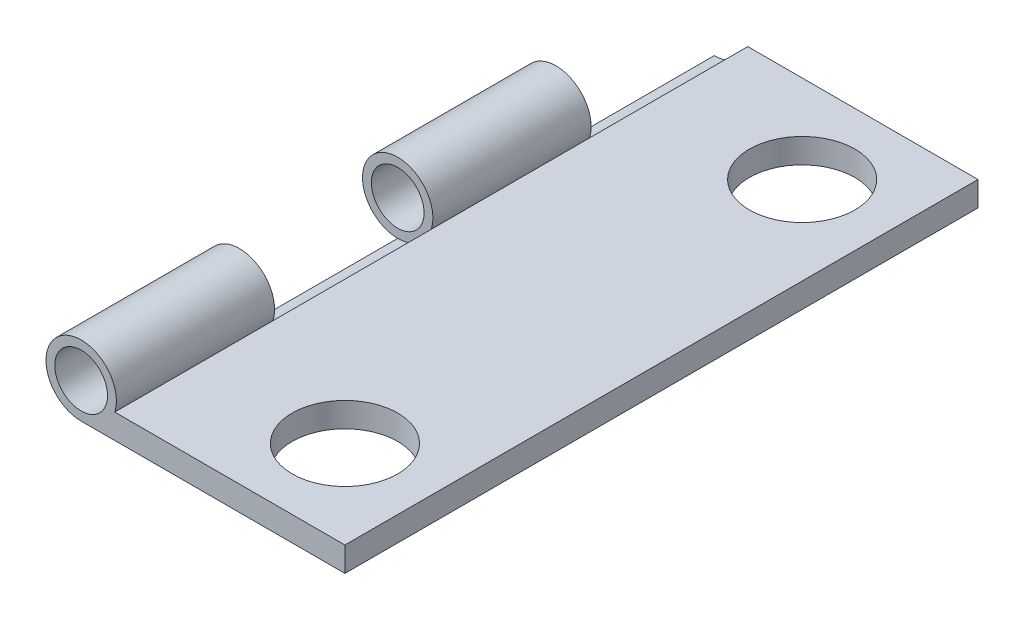
ISO-10303-21;
HEADER;
FILE_DESCRIPTION(('STEP AP214'),'2;1');
FILE_NAME('part.step','',(''),(''),'','','');
FILE_SCHEMA(('AUTOMOTIVE_DESIGN { 1 0 10303 214 1 1 1 1 }'));
ENDSEC;
DATA;
#1=APPLICATION_CONTEXT('core data for automotive mechanical design processes');
#2=APPLICATION_PROTOCOL_DEFINITION('international standard','automotive_design',2000,#1);
#3=PRODUCT_CONTEXT('',#1,'mechanical');
#4=PRODUCT('Part','Part','',(#3));
#5=PRODUCT_RELATED_PRODUCT_CATEGORY('part','',(#4));
#6=PRODUCT_DEFINITION_FORMATION('','',#4);
#7=PRODUCT_DEFINITION_CONTEXT('part definition',#1,'design');
#8=PRODUCT_DEFINITION('design','',#6,#7);
#9=PRODUCT_DEFINITION_SHAPE('','',#8);
#10=(LENGTH_UNIT() NAMED_UNIT(*) SI_UNIT(.MILLI.,.METRE.));
#11=(NAMED_UNIT(*) PLANE_ANGLE_UNIT() SI_UNIT($,.RADIAN.));
#12=(NAMED_UNIT(*) SI_UNIT($,.STERADIAN.) SOLID_ANGLE_UNIT());
#13=UNCERTAINTY_MEASURE_WITH_UNIT(LENGTH_MEASURE(1.E-05),#10,'distance_accuracy_value','');
#14=(GEOMETRIC_REPRESENTATION_CONTEXT(3) GLOBAL_UNCERTAINTY_ASSIGNED_CONTEXT((#13)) GLOBAL_UNIT_ASSIGNED_CONTEXT((#10,
#11,#12)) REPRESENTATION_CONTEXT('',''));
#15=CARTESIAN_POINT('',(0.,0.,0.));
#16=DIRECTION('',(0.,0.,1.));
#17=DIRECTION('',(1.,0.,0.));
#18=AXIS2_PLACEMENT_3D('',#15,#16,#17);
#19=CARTESIAN_POINT('',(0.,1.,-18.));
#20=DIRECTION('',(0.,0.,1.));
#21=DIRECTION('',(1.,0.,0.));
#22=AXIS2_PLACEMENT_3D('',#19,#20,#21);
#23=CYLINDRICAL_SURFACE('',#22,1.);
#24=CARTESIAN_POINT('',(0.,1.,-13.5));
#25=DIRECTION('',(0.,0.,1.));
#26=DIRECTION('',(1.,0.,0.));
#27=AXIS2_PLACEMENT_3D('',#24,#25,#26);
#28=CIRCLE('',#27,1.);
#29=CARTESIAN_POINT('',(0.953939201416945,0.7,-13.5));
#30=VERTEX_POINT('',#29);
#31=CARTESIAN_POINT('',(0.,0.,-13.5));
#32=VERTEX_POINT('',#31);
#33=EDGE_CURVE('E113',#30,#32,#28,.T.);
#34=ORIENTED_EDGE('',*,*,#33,.T.);
#35=DIRECTION('',(0.,0.,1.));
#36=VECTOR('',#35,1.);
#37=CARTESIAN_POINT('',(0.,0.,0.));
#38=LINE('',#37,#36);
#39=CARTESIAN_POINT('',(0.,0.,-9.));
#40=VERTEX_POINT('',#39);
#41=EDGE_CURVE('E106',#32,#40,#38,.T.);
#42=ORIENTED_EDGE('',*,*,#41,.T.);
#43=CARTESIAN_POINT('',(0.,1.,-9.));
#44=DIRECTION('',(0.,0.,1.));
#45=DIRECTION('',(1.,0.,0.));
#46=AXIS2_PLACEMENT_3D('',#43,#44,#45);
#47=CIRCLE('',#46,1.);
#48=CARTESIAN_POINT('',(0.953939201416945,0.7,-9.));
#49=VERTEX_POINT('',#48);
#50=EDGE_CURVE('E146',#49,#40,#47,.T.);
#51=ORIENTED_EDGE('',*,*,#50,.F.);
#52=DIRECTION('',(0.,0.,1.));
#53=VECTOR('',#52,1.);
#54=CARTESIAN_POINT('',(0.953939201416946,0.7,-18.));
#55=LINE('',#54,#53);
#56=EDGE_CURVE('E118',#30,#49,#55,.T.);
#57=ORIENTED_EDGE('',*,*,#56,.F.);
#58=EDGE_LOOP('',(#34,#42,#51,#57));
#59=FACE_BOUND('',#58,.T.);
#60=ADVANCED_FACE('F32',(#59),#23,.T.);
#61=CARTESIAN_POINT('',(0.,1.,-18.));
#62=DIRECTION('',(0.,0.,1.));
#63=DIRECTION('',(1.,0.,0.));
#64=AXIS2_PLACEMENT_3D('',#61,#62,#63);
#65=CYLINDRICAL_SURFACE('',#64,0.75);
#66=CARTESIAN_POINT('',(0.,1.,-13.5));
#67=DIRECTION('',(0.,0.,1.));
#68=DIRECTION('',(1.,0.,0.));
#69=AXIS2_PLACEMENT_3D('',#66,#67,#68);
#70=CIRCLE('',#69,0.75);
#71=CARTESIAN_POINT('',(0.75,1.,-13.5));
#72=VERTEX_POINT('',#71);
#73=EDGE_CURVE('E152',#72,#72,#70,.F.);
#74=ORIENTED_EDGE('',*,*,#73,.T.);
#75=EDGE_LOOP('',(#74));
#76=FACE_BOUND('',#75,.T.);
#77=CARTESIAN_POINT('',(0.,1.,-9.));
#78=DIRECTION('',(0.,0.,1.));
#79=DIRECTION('',(1.,0.,0.));
#80=AXIS2_PLACEMENT_3D('',#77,#78,#79);
#81=CIRCLE('',#80,0.75);
#82=CARTESIAN_POINT('',(0.75,1.,-9.));
#83=VERTEX_POINT('',#82);
#84=EDGE_CURVE('E36',#83,#83,#81,.F.);
#85=ORIENTED_EDGE('',*,*,#84,.F.);
#86=EDGE_LOOP('',(#85));
#87=FACE_BOUND('',#86,.T.);
#88=ADVANCED_FACE('F206',(#76,#87),#65,.F.);
#89=CARTESIAN_POINT('',(0.,0.7,0.));
#90=DIRECTION('',(0.,0.,-1.));
#91=DIRECTION('',(-1.,0.,0.));
#92=AXIS2_PLACEMENT_3D('',#89,#90,#91);
#93=PLANE('',#92);
#94=CARTESIAN_POINT('',(0.,1.,0.));
#95=DIRECTION('',(0.,0.,1.));
#96=DIRECTION('',(1.,0.,0.));
#97=AXIS2_PLACEMENT_3D('',#94,#95,#96);
#98=CIRCLE('',#97,0.75);
#99=CARTESIAN_POINT('',(0.75,1.,0.));
#100=VERTEX_POINT('',#99);
#101=EDGE_CURVE('E140',#100,#100,#98,.T.);
#102=ORIENTED_EDGE('',*,*,#101,.F.);
#103=EDGE_LOOP('',(#102));
#104=FACE_BOUND('',#103,.T.);
#105=CARTESIAN_POINT('',(0.,1.,0.));
#106=DIRECTION('',(0.,0.,1.));
#107=DIRECTION('',(1.,0.,0.));
#108=AXIS2_PLACEMENT_3D('',#105,#106,#107);
#109=CIRCLE('',#108,1.);
#110=CARTESIAN_POINT('',(0.953939201416946,0.7,0.));
#111=VERTEX_POINT('',#110);
#112=CARTESIAN_POINT('',(0.,0.,0.));
#113=VERTEX_POINT('',#112);
#114=EDGE_CURVE('E138',#111,#113,#109,.T.);
#115=ORIENTED_EDGE('',*,*,#114,.T.);
#116=DIRECTION('',(1.,0.,0.));
#117=VECTOR('',#116,1.);
#118=CARTESIAN_POINT('',(0.,0.,0.));
#119=LINE('',#118,#117);
#120=CARTESIAN_POINT('',(7.5,0.,0.));
#121=VERTEX_POINT('',#120);
#122=EDGE_CURVE('E105',#113,#121,#119,.T.);
#123=ORIENTED_EDGE('',*,*,#122,.T.);
#124=DIRECTION('',(0.,-1.,0.));
#125=VECTOR('',#124,1.);
#126=CARTESIAN_POINT('',(7.5,0.7,0.));
#127=LINE('',#126,#125);
#128=CARTESIAN_POINT('',(7.5,0.7,0.));
#129=VERTEX_POINT('',#128);
#130=EDGE_CURVE('E11',#129,#121,#127,.T.);
#131=ORIENTED_EDGE('',*,*,#130,.F.);
#132=DIRECTION('',(1.,0.,0.));
#133=VECTOR('',#132,1.);
#134=CARTESIAN_POINT('',(0.,0.7,0.));
#135=LINE('',#134,#133);
#136=EDGE_CURVE('E191',#111,#129,#135,.T.);
#137=ORIENTED_EDGE('',*,*,#136,.F.);
#138=EDGE_LOOP('',(#115,#123,#131,#137));
#139=FACE_BOUND('',#138,.T.);
#140=ADVANCED_FACE('F34',(#104,#139),#93,.F.);
#141=CARTESIAN_POINT('',(7.5,0.7,0.));
#142=DIRECTION('',(-1.,0.,0.));
#143=DIRECTION('',(0.,0.,1.));
#144=AXIS2_PLACEMENT_3D('',#141,#142,#143);
#145=PLANE('',#144);
#146=DIRECTION('',(0.,0.,-1.));
#147=VECTOR('',#146,1.);
#148=CARTESIAN_POINT('',(7.5,0.,0.));
#149=LINE('',#148,#147);
#150=CARTESIAN_POINT('',(7.5,0.,-18.));
#151=VERTEX_POINT('',#150);
#152=EDGE_CURVE('E195',#121,#151,#149,.T.);
#153=ORIENTED_EDGE('',*,*,#152,.T.);
#154=DIRECTION('',(0.,-1.,0.));
#155=VECTOR('',#154,1.);
#156=CARTESIAN_POINT('',(7.5,0.7,-18.));
#157=LINE('',#156,#155);
#158=CARTESIAN_POINT('',(7.5,0.7,-18.));
#159=VERTEX_POINT('',#158);
#160=EDGE_CURVE('E41',#159,#151,#157,.T.);
#161=ORIENTED_EDGE('',*,*,#160,.F.);
#162=DIRECTION('',(0.,0.,-1.));
#163=VECTOR('',#162,1.);
#164=CARTESIAN_POINT('',(7.5,0.7,0.));
#165=LINE('',#164,#163);
#166=EDGE_CURVE('E186',#129,#159,#165,.T.);
#167=ORIENTED_EDGE('',*,*,#166,.F.);
#168=ORIENTED_EDGE('',*,*,#130,.T.);
#169=EDGE_LOOP('',(#153,#161,#167,#168));
#170=FACE_BOUND('',#169,.T.);
#171=ADVANCED_FACE('F215',(#170),#145,.F.);
#172=CARTESIAN_POINT('',(0.,0.7,-18.));
#173=DIRECTION('',(0.,0.,1.));
#174=DIRECTION('',(1.,0.,0.));
#175=AXIS2_PLACEMENT_3D('',#172,#173,#174);
#176=PLANE('',#175);
#177=DIRECTION('',(-1.,0.,0.));
#178=VECTOR('',#177,1.);
#179=CARTESIAN_POINT('',(0.,0.,-18.));
#180=LINE('',#179,#178);
#181=CARTESIAN_POINT('',(0.,0.,-18.));
#182=VERTEX_POINT('',#181);
#183=EDGE_CURVE('E193',#151,#182,#180,.T.);
#184=ORIENTED_EDGE('',*,*,#183,.T.);
#185=CARTESIAN_POINT('',(0.,1.,-18.));
#186=DIRECTION('',(0.,0.,1.));
#187=DIRECTION('',(1.,0.,0.));
#188=AXIS2_PLACEMENT_3D('',#185,#186,#187);
#189=CIRCLE('',#188,1.);
#190=CARTESIAN_POINT('',(0.953939201416945,0.7,-18.));
#191=VERTEX_POINT('',#190);
#192=EDGE_CURVE('E100',#182,#191,#189,.T.);
#193=ORIENTED_EDGE('',*,*,#192,.T.);
#194=DIRECTION('',(-1.,0.,0.));
#195=VECTOR('',#194,1.);
#196=CARTESIAN_POINT('',(0.,0.7,-18.));
#197=LINE('',#196,#195);
#198=EDGE_CURVE('E184',#159,#191,#197,.T.);
#199=ORIENTED_EDGE('',*,*,#198,.F.);
#200=ORIENTED_EDGE('',*,*,#160,.T.);
#201=EDGE_LOOP('',(#184,#193,#199,#200));
#202=FACE_BOUND('',#201,.T.);
#203=ADVANCED_FACE('F180',(#202),#176,.F.);
#204=CARTESIAN_POINT('',(0.,0.7,0.));
#205=DIRECTION('',(0.,-1.,0.));
#206=DIRECTION('',(0.,0.,-1.));
#207=AXIS2_PLACEMENT_3D('',#204,#205,#206);
#208=PLANE('',#207);
#209=CARTESIAN_POINT('',(5.,0.7,-2.5));
#210=DIRECTION('',(0.,1.,0.));
#211=DIRECTION('',(0.,0.,1.));
#212=AXIS2_PLACEMENT_3D('',#209,#210,#211);
#213=CIRCLE('',#212,1.5);
#214=CARTESIAN_POINT('',(5.,0.7,-0.999999999999999));
#215=VERTEX_POINT('',#214);
#216=EDGE_CURVE('E162',#215,#215,#213,.T.);
#217=ORIENTED_EDGE('',*,*,#216,.F.);
#218=EDGE_LOOP('',(#217));
#219=FACE_BOUND('',#218,.T.);
#220=CARTESIAN_POINT('',(5.,0.7,-15.5));
#221=DIRECTION('',(0.,1.,0.));
#222=DIRECTION('',(0.,0.,-1.));
#223=AXIS2_PLACEMENT_3D('',#220,#221,#222);
#224=CIRCLE('',#223,1.5);
#225=CARTESIAN_POINT('',(5.,0.7,-17.));
#226=VERTEX_POINT('',#225);
#227=EDGE_CURVE('E156',#226,#226,#224,.T.);
#228=ORIENTED_EDGE('',*,*,#227,.F.);
#229=EDGE_LOOP('',(#228));
#230=FACE_BOUND('',#229,.T.);
#231=ORIENTED_EDGE('',*,*,#198,.T.);
#232=EDGE_CURVE('E127',#191,#30,#55,.T.);
#233=ORIENTED_EDGE('',*,*,#232,.T.);
#234=ORIENTED_EDGE('',*,*,#56,.T.);
#235=CARTESIAN_POINT('',(0.953939201416945,0.7,-4.5));
#236=VERTEX_POINT('',#235);
#237=EDGE_CURVE('E133',#49,#236,#55,.T.);
#238=ORIENTED_EDGE('',*,*,#237,.T.);
#239=EDGE_CURVE('E56',#236,#111,#55,.T.);
#240=ORIENTED_EDGE('',*,*,#239,.T.);
#241=ORIENTED_EDGE('',*,*,#136,.T.);
#242=ORIENTED_EDGE('',*,*,#166,.T.);
#243=EDGE_LOOP('',(#231,#233,#234,#238,#240,#241,#242));
#244=FACE_BOUND('',#243,.T.);
#245=ADVANCED_FACE('F177',(#219,#230,#244),#208,.F.);
#246=CARTESIAN_POINT('',(0.,0.,0.));
#247=DIRECTION('',(0.,-1.,0.));
#248=DIRECTION('',(0.,0.,-1.));
#249=AXIS2_PLACEMENT_3D('',#246,#247,#248);
#250=PLANE('',#249);
#251=CARTESIAN_POINT('',(5.,0.,-2.5));
#252=DIRECTION('',(0.,1.,0.));
#253=DIRECTION('',(0.,0.,1.));
#254=AXIS2_PLACEMENT_3D('',#251,#252,#253);
#255=CIRCLE('',#254,1.5);
#256=CARTESIAN_POINT('',(5.,0.,-0.999999999999999));
#257=VERTEX_POINT('',#256);
#258=EDGE_CURVE('E120',#257,#257,#255,.T.);
#259=ORIENTED_EDGE('',*,*,#258,.T.);
#260=EDGE_LOOP('',(#259));
#261=FACE_BOUND('',#260,.T.);
#262=CARTESIAN_POINT('',(5.,0.,-15.5));
#263=DIRECTION('',(0.,1.,0.));
#264=DIRECTION('',(0.,0.,-1.));
#265=AXIS2_PLACEMENT_3D('',#262,#263,#264);
#266=CIRCLE('',#265,1.5);
#267=CARTESIAN_POINT('',(5.,0.,-17.));
#268=VERTEX_POINT('',#267);
#269=EDGE_CURVE('E159',#268,#268,#266,.T.);
#270=ORIENTED_EDGE('',*,*,#269,.T.);
#271=EDGE_LOOP('',(#270));
#272=FACE_BOUND('',#271,.T.);
#273=EDGE_CURVE('E94',#182,#32,#38,.T.);
#274=ORIENTED_EDGE('',*,*,#273,.F.);
#275=ORIENTED_EDGE('',*,*,#183,.F.);
#276=ORIENTED_EDGE('',*,*,#152,.F.);
#277=ORIENTED_EDGE('',*,*,#122,.F.);
#278=CARTESIAN_POINT('',(0.,0.,-4.5));
#279=VERTEX_POINT('',#278);
#280=EDGE_CURVE('E124',#279,#113,#38,.T.);
#281=ORIENTED_EDGE('',*,*,#280,.F.);
#282=EDGE_CURVE('E108',#40,#279,#38,.T.);
#283=ORIENTED_EDGE('',*,*,#282,.F.);
#284=ORIENTED_EDGE('',*,*,#41,.F.);
#285=EDGE_LOOP('',(#274,#275,#276,#277,#281,#283,#284));
#286=FACE_BOUND('',#285,.T.);
#287=ADVANCED_FACE('F122',(#261,#272,#286),#250,.T.);
#288=CARTESIAN_POINT('',(0.,1.,-4.5));
#289=DIRECTION('',(0.,0.,1.));
#290=DIRECTION('',(1.,0.,0.));
#291=AXIS2_PLACEMENT_3D('',#288,#289,#290);
#292=CIRCLE('',#291,1.);
#293=EDGE_CURVE('E147',#236,#279,#292,.T.);
#294=ORIENTED_EDGE('',*,*,#293,.T.);
#295=ORIENTED_EDGE('',*,*,#280,.T.);
#296=ORIENTED_EDGE('',*,*,#114,.F.);
#297=ORIENTED_EDGE('',*,*,#239,.F.);
#298=EDGE_LOOP('',(#294,#295,#296,#297));
#299=FACE_BOUND('',#298,.T.);
#300=ADVANCED_FACE('F218',(#299),#23,.T.);
#301=CARTESIAN_POINT('',(0.,1.,-4.5));
#302=DIRECTION('',(0.,0.,1.));
#303=DIRECTION('',(1.,0.,0.));
#304=AXIS2_PLACEMENT_3D('',#301,#302,#303);
#305=CIRCLE('',#304,0.75);
#306=CARTESIAN_POINT('',(0.75,1.,-4.5));
#307=VERTEX_POINT('',#306);
#308=EDGE_CURVE('E151',#307,#307,#305,.F.);
#309=ORIENTED_EDGE('',*,*,#308,.T.);
#310=EDGE_LOOP('',(#309));
#311=FACE_BOUND('',#310,.T.);
#312=ORIENTED_EDGE('',*,*,#101,.T.);
#313=EDGE_LOOP('',(#312));
#314=FACE_BOUND('',#313,.T.);
#315=ADVANCED_FACE('F210',(#311,#314),#65,.F.);
#316=CARTESIAN_POINT('',(0.,1.,-9.));
#317=DIRECTION('',(0.,0.,1.));
#318=DIRECTION('',(1.,0.,0.));
#319=AXIS2_PLACEMENT_3D('',#316,#317,#318);
#320=CYLINDRICAL_SURFACE('',#319,1.);
#321=EDGE_CURVE('E148',#40,#49,#47,.T.);
#322=ORIENTED_EDGE('',*,*,#321,.F.);
#323=ORIENTED_EDGE('',*,*,#282,.T.);
#324=EDGE_CURVE('E48',#279,#236,#292,.T.);
#325=ORIENTED_EDGE('',*,*,#324,.T.);
#326=ORIENTED_EDGE('',*,*,#237,.F.);
#327=EDGE_LOOP('',(#322,#323,#325,#326));
#328=FACE_BOUND('',#327,.T.);
#329=ADVANCED_FACE('F221',(#328),#320,.F.);
#330=CARTESIAN_POINT('',(0.,1.,-9.));
#331=DIRECTION('',(0.,0.,1.));
#332=DIRECTION('',(1.,0.,0.));
#333=AXIS2_PLACEMENT_3D('',#330,#331,#332);
#334=PLANE('',#333);
#335=ORIENTED_EDGE('',*,*,#321,.T.);
#336=ORIENTED_EDGE('',*,*,#50,.T.);
#337=EDGE_LOOP('',(#335,#336));
#338=FACE_BOUND('',#337,.T.);
#339=ORIENTED_EDGE('',*,*,#84,.T.);
#340=EDGE_LOOP('',(#339));
#341=FACE_BOUND('',#340,.T.);
#342=ADVANCED_FACE('F204',(#338,#341),#334,.T.);
#343=CARTESIAN_POINT('',(0.,1.,-4.5));
#344=DIRECTION('',(0.,0.,1.));
#345=DIRECTION('',(1.,0.,0.));
#346=AXIS2_PLACEMENT_3D('',#343,#344,#345);
#347=PLANE('',#346);
#348=ORIENTED_EDGE('',*,*,#324,.F.);
#349=ORIENTED_EDGE('',*,*,#293,.F.);
#350=EDGE_LOOP('',(#348,#349));
#351=FACE_BOUND('',#350,.T.);
#352=ORIENTED_EDGE('',*,*,#308,.F.);
#353=EDGE_LOOP('',(#352));
#354=FACE_BOUND('',#353,.T.);
#355=ADVANCED_FACE('F240',(#351,#354),#347,.F.);
#356=CARTESIAN_POINT('',(0.,1.,-18.));
#357=DIRECTION('',(0.,0.,1.));
#358=DIRECTION('',(1.,0.,0.));
#359=AXIS2_PLACEMENT_3D('',#356,#357,#358);
#360=CYLINDRICAL_SURFACE('',#359,1.);
#361=ORIENTED_EDGE('',*,*,#192,.F.);
#362=ORIENTED_EDGE('',*,*,#273,.T.);
#363=EDGE_CURVE('E97',#32,#30,#28,.T.);
#364=ORIENTED_EDGE('',*,*,#363,.T.);
#365=ORIENTED_EDGE('',*,*,#232,.F.);
#366=EDGE_LOOP('',(#361,#362,#364,#365));
#367=FACE_BOUND('',#366,.T.);
#368=ADVANCED_FACE('F96',(#367),#360,.F.);
#369=CARTESIAN_POINT('',(0.,1.,-13.5));
#370=DIRECTION('',(0.,0.,1.));
#371=DIRECTION('',(1.,0.,0.));
#372=AXIS2_PLACEMENT_3D('',#369,#370,#371);
#373=PLANE('',#372);
#374=ORIENTED_EDGE('',*,*,#363,.F.);
#375=ORIENTED_EDGE('',*,*,#33,.F.);
#376=EDGE_LOOP('',(#374,#375));
#377=FACE_BOUND('',#376,.T.);
#378=ORIENTED_EDGE('',*,*,#73,.F.);
#379=EDGE_LOOP('',(#378));
#380=FACE_BOUND('',#379,.T.);
#381=ADVANCED_FACE('F111',(#377,#380),#373,.F.);
#382=CARTESIAN_POINT('',(5.,0.,-15.5));
#383=DIRECTION('',(0.,1.,0.));
#384=DIRECTION('',(0.,0.,1.));
#385=AXIS2_PLACEMENT_3D('',#382,#383,#384);
#386=CYLINDRICAL_SURFACE('',#385,1.5);
#387=ORIENTED_EDGE('',*,*,#269,.F.);
#388=EDGE_LOOP('',(#387));
#389=FACE_BOUND('',#388,.T.);
#390=ORIENTED_EDGE('',*,*,#227,.T.);
#391=EDGE_LOOP('',(#390));
#392=FACE_BOUND('',#391,.T.);
#393=ADVANCED_FACE('F173',(#389,#392),#386,.F.);
#394=CARTESIAN_POINT('',(5.,0.,-2.5));
#395=DIRECTION('',(0.,1.,0.));
#396=DIRECTION('',(0.,0.,1.));
#397=AXIS2_PLACEMENT_3D('',#394,#395,#396);
#398=CYLINDRICAL_SURFACE('',#397,1.5);
#399=ORIENTED_EDGE('',*,*,#258,.F.);
#400=EDGE_LOOP('',(#399));
#401=FACE_BOUND('',#400,.T.);
#402=ORIENTED_EDGE('',*,*,#216,.T.);
#403=EDGE_LOOP('',(#402));
#404=FACE_BOUND('',#403,.T.);
#405=ADVANCED_FACE('F170',(#401,#404),#398,.F.);
#406=CLOSED_SHELL('',(#60,#88,#140,#171,#203,#245,#287,#300,#315,#329,#342,#355,#368,#381,#393,#405));
#407=MANIFOLD_SOLID_BREP('B2',#406);
#408=ADVANCED_BREP_SHAPE_REPRESENTATION('',(#18,#407),#14);
#409=SHAPE_DEFINITION_REPRESENTATION(#9,#408);
ENDSEC;
END-ISO-10303-21;
